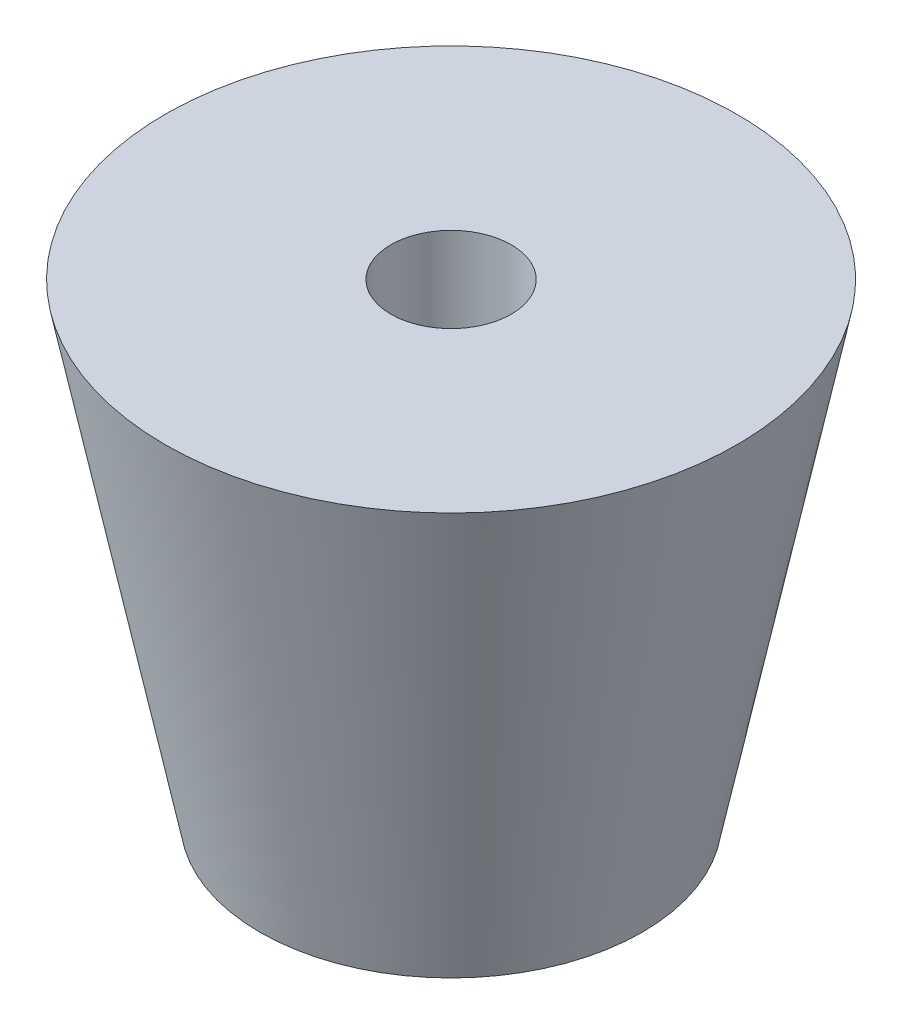
ISO-10303-21;
HEADER;
FILE_DESCRIPTION(('STEP AP214'),'2;1');
FILE_NAME('part.step','',(''),(''),'','','');
FILE_SCHEMA(('AUTOMOTIVE_DESIGN { 1 0 10303 214 1 1 1 1 }'));
ENDSEC;
DATA;
#1=APPLICATION_CONTEXT('core data for automotive mechanical design processes');
#2=APPLICATION_PROTOCOL_DEFINITION('international standard','automotive_design',2000,#1);
#3=PRODUCT_CONTEXT('',#1,'mechanical');
#4=PRODUCT('Part','Part','',(#3));
#5=PRODUCT_RELATED_PRODUCT_CATEGORY('part','',(#4));
#6=PRODUCT_DEFINITION_FORMATION('','',#4);
#7=PRODUCT_DEFINITION_CONTEXT('part definition',#1,'design');
#8=PRODUCT_DEFINITION('design','',#6,#7);
#9=PRODUCT_DEFINITION_SHAPE('','',#8);
#10=(LENGTH_UNIT() NAMED_UNIT(*) SI_UNIT(.MILLI.,.METRE.));
#11=(NAMED_UNIT(*) PLANE_ANGLE_UNIT() SI_UNIT($,.RADIAN.));
#12=(NAMED_UNIT(*) SI_UNIT($,.STERADIAN.) SOLID_ANGLE_UNIT());
#13=UNCERTAINTY_MEASURE_WITH_UNIT(LENGTH_MEASURE(1.E-05),#10,'distance_accuracy_value','');
#14=(GEOMETRIC_REPRESENTATION_CONTEXT(3) GLOBAL_UNCERTAINTY_ASSIGNED_CONTEXT((#13)) GLOBAL_UNIT_ASSIGNED_CONTEXT((#10,
#11,#12)) REPRESENTATION_CONTEXT('',''));
#15=CARTESIAN_POINT('',(0.,0.,0.));
#16=DIRECTION('',(0.,0.,1.));
#17=DIRECTION('',(1.,0.,0.));
#18=AXIS2_PLACEMENT_3D('',#15,#16,#17);
#19=CARTESIAN_POINT('',(0.,11.6166602167183,0.));
#20=DIRECTION('',(0.,1.,0.));
#21=DIRECTION('',(0.,0.,1.));
#22=AXIS2_PLACEMENT_3D('',#19,#20,#21);
#23=CYLINDRICAL_SURFACE('',#22,2.);
#24=CARTESIAN_POINT('',(0.,-3.43214009287926,0.));
#25=DIRECTION('',(0.,1.,0.));
#26=DIRECTION('',(0.,0.,1.));
#27=AXIS2_PLACEMENT_3D('',#24,#25,#26);
#28=CIRCLE('',#27,2.);
#29=CARTESIAN_POINT('',(0.,-3.43214009287926,2.));
#30=VERTEX_POINT('',#29);
#31=EDGE_CURVE('E53',#30,#30,#28,.T.);
#32=ORIENTED_EDGE('',*,*,#31,.F.);
#33=EDGE_LOOP('',(#32));
#34=FACE_BOUND('',#33,.T.);
#35=CARTESIAN_POINT('',(0.,7.36785990712074,0.));
#36=DIRECTION('',(0.,1.,0.));
#37=DIRECTION('',(0.,0.,1.));
#38=AXIS2_PLACEMENT_3D('',#35,#36,#37);
#39=CIRCLE('',#38,2.);
#40=CARTESIAN_POINT('',(0.,7.36785990712074,2.));
#41=VERTEX_POINT('',#40);
#42=EDGE_CURVE('E10',#41,#41,#39,.T.);
#43=ORIENTED_EDGE('',*,*,#42,.T.);
#44=EDGE_LOOP('',(#43));
#45=FACE_BOUND('',#44,.T.);
#46=ADVANCED_FACE('F31',(#34,#45),#23,.F.);
#47=CARTESIAN_POINT('',(2.,7.36785990712074,0.));
#48=DIRECTION('',(0.,-1.,0.));
#49=DIRECTION('',(0.,0.,-1.));
#50=AXIS2_PLACEMENT_3D('',#47,#48,#49);
#51=PLANE('',#50);
#52=ORIENTED_EDGE('',*,*,#42,.F.);
#53=EDGE_LOOP('',(#52));
#54=FACE_BOUND('',#53,.T.);
#55=CARTESIAN_POINT('',(0.,7.36785990712074,0.));
#56=DIRECTION('',(0.,1.,0.));
#57=DIRECTION('',(0.,0.,1.));
#58=AXIS2_PLACEMENT_3D('',#55,#56,#57);
#59=CIRCLE('',#58,9.5);
#60=CARTESIAN_POINT('',(0.,7.36785990712074,9.5));
#61=VERTEX_POINT('',#60);
#62=EDGE_CURVE('E37',#61,#61,#59,.T.);
#63=ORIENTED_EDGE('',*,*,#62,.T.);
#64=EDGE_LOOP('',(#63));
#65=FACE_BOUND('',#64,.T.);
#66=ADVANCED_FACE('F60',(#54,#65),#51,.F.);
#67=CARTESIAN_POINT('',(0.,-8.23214009287926,0.));
#68=DIRECTION('',(0.,1.,0.));
#69=DIRECTION('',(0.,0.,1.));
#70=AXIS2_PLACEMENT_3D('',#67,#68,#69);
#71=CONICAL_SURFACE('',#70,6.35,0.199243986580206);
#72=ORIENTED_EDGE('',*,*,#62,.F.);
#73=EDGE_LOOP('',(#72));
#74=FACE_BOUND('',#73,.T.);
#75=CARTESIAN_POINT('',(0.,-8.23214009287926,0.));
#76=DIRECTION('',(0.,1.,0.));
#77=DIRECTION('',(0.,0.,1.));
#78=AXIS2_PLACEMENT_3D('',#75,#76,#77);
#79=CIRCLE('',#78,6.35);
#80=CARTESIAN_POINT('',(0.,-8.23214009287926,6.35));
#81=VERTEX_POINT('',#80);
#82=EDGE_CURVE('E41',#81,#81,#79,.T.);
#83=ORIENTED_EDGE('',*,*,#82,.T.);
#84=EDGE_LOOP('',(#83));
#85=FACE_BOUND('',#84,.T.);
#86=ADVANCED_FACE('F64',(#74,#85),#71,.T.);
#87=CARTESIAN_POINT('',(3.95,-8.23214009287926,0.));
#88=DIRECTION('',(0.,1.,0.));
#89=DIRECTION('',(0.,0.,1.));
#90=AXIS2_PLACEMENT_3D('',#87,#88,#89);
#91=PLANE('',#90);
#92=ORIENTED_EDGE('',*,*,#82,.F.);
#93=EDGE_LOOP('',(#92));
#94=FACE_BOUND('',#93,.T.);
#95=CARTESIAN_POINT('',(0.,-8.23214009287926,0.));
#96=DIRECTION('',(0.,1.,0.));
#97=DIRECTION('',(0.,0.,1.));
#98=AXIS2_PLACEMENT_3D('',#95,#96,#97);
#99=CIRCLE('',#98,3.95);
#100=CARTESIAN_POINT('',(0.,-8.23214009287926,3.95));
#101=VERTEX_POINT('',#100);
#102=EDGE_CURVE('E45',#101,#101,#99,.T.);
#103=ORIENTED_EDGE('',*,*,#102,.T.);
#104=EDGE_LOOP('',(#103));
#105=FACE_BOUND('',#104,.T.);
#106=ADVANCED_FACE('F69',(#94,#105),#91,.F.);
#107=CARTESIAN_POINT('',(0.,11.6166602167183,0.));
#108=DIRECTION('',(0.,1.,0.));
#109=DIRECTION('',(0.,0.,1.));
#110=AXIS2_PLACEMENT_3D('',#107,#108,#109);
#111=CYLINDRICAL_SURFACE('',#110,3.95);
#112=ORIENTED_EDGE('',*,*,#102,.F.);
#113=EDGE_LOOP('',(#112));
#114=FACE_BOUND('',#113,.T.);
#115=CARTESIAN_POINT('',(0.,-3.43214009287926,0.));
#116=DIRECTION('',(0.,1.,0.));
#117=DIRECTION('',(0.,0.,1.));
#118=AXIS2_PLACEMENT_3D('',#115,#116,#117);
#119=CIRCLE('',#118,3.95);
#120=CARTESIAN_POINT('',(0.,-3.43214009287926,3.95));
#121=VERTEX_POINT('',#120);
#122=EDGE_CURVE('E50',#121,#121,#119,.T.);
#123=ORIENTED_EDGE('',*,*,#122,.T.);
#124=EDGE_LOOP('',(#123));
#125=FACE_BOUND('',#124,.T.);
#126=ADVANCED_FACE('F75',(#114,#125),#111,.F.);
#127=CARTESIAN_POINT('',(2.,-3.43214009287926,0.));
#128=DIRECTION('',(0.,1.,0.));
#129=DIRECTION('',(0.,0.,1.));
#130=AXIS2_PLACEMENT_3D('',#127,#128,#129);
#131=PLANE('',#130);
#132=ORIENTED_EDGE('',*,*,#122,.F.);
#133=EDGE_LOOP('',(#132));
#134=FACE_BOUND('',#133,.T.);
#135=ORIENTED_EDGE('',*,*,#31,.T.);
#136=EDGE_LOOP('',(#135));
#137=FACE_BOUND('',#136,.T.);
#138=ADVANCED_FACE('F57',(#134,#137),#131,.F.);
#139=CLOSED_SHELL('',(#46,#66,#86,#106,#126,#138));
#140=MANIFOLD_SOLID_BREP('B2',#139);
#141=ADVANCED_BREP_SHAPE_REPRESENTATION('',(#18,#140),#14);
#142=SHAPE_DEFINITION_REPRESENTATION(#9,#141);
ENDSEC;
END-ISO-10303-21;
